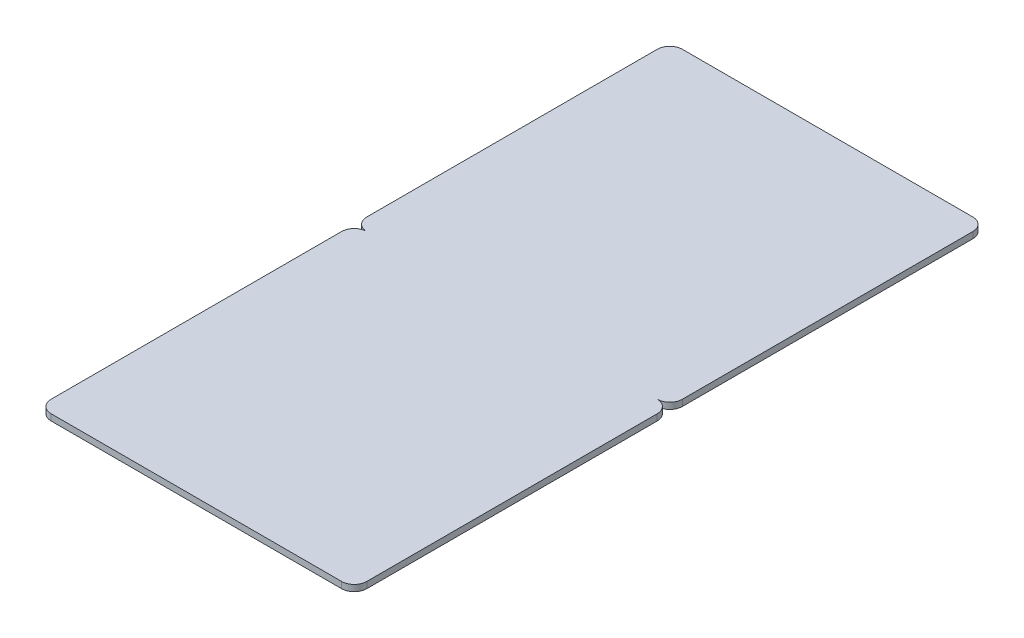
ISO-10303-21;
HEADER;
FILE_DESCRIPTION(('STEP AP214'),'2;1');
FILE_NAME('part.step','',(''),(''),'','','');
FILE_SCHEMA(('AUTOMOTIVE_DESIGN { 1 0 10303 214 1 1 1 1 }'));
ENDSEC;
DATA;
#1=APPLICATION_CONTEXT('core data for automotive mechanical design processes');
#2=APPLICATION_PROTOCOL_DEFINITION('international standard','automotive_design',2000,#1);
#3=PRODUCT_CONTEXT('',#1,'mechanical');
#4=PRODUCT('Part','Part','',(#3));
#5=PRODUCT_RELATED_PRODUCT_CATEGORY('part','',(#4));
#6=PRODUCT_DEFINITION_FORMATION('','',#4);
#7=PRODUCT_DEFINITION_CONTEXT('part definition',#1,'design');
#8=PRODUCT_DEFINITION('design','',#6,#7);
#9=PRODUCT_DEFINITION_SHAPE('','',#8);
#10=(LENGTH_UNIT() NAMED_UNIT(*) SI_UNIT(.MILLI.,.METRE.));
#11=(NAMED_UNIT(*) PLANE_ANGLE_UNIT() SI_UNIT($,.RADIAN.));
#12=(NAMED_UNIT(*) SI_UNIT($,.STERADIAN.) SOLID_ANGLE_UNIT());
#13=UNCERTAINTY_MEASURE_WITH_UNIT(LENGTH_MEASURE(1.E-05),#10,'distance_accuracy_value','');
#14=(GEOMETRIC_REPRESENTATION_CONTEXT(3) GLOBAL_UNCERTAINTY_ASSIGNED_CONTEXT((#13)) GLOBAL_UNIT_ASSIGNED_CONTEXT((#10,
#11,#12)) REPRESENTATION_CONTEXT('',''));
#15=CARTESIAN_POINT('',(0.,0.,0.));
#16=DIRECTION('',(0.,0.,1.));
#17=DIRECTION('',(1.,0.,0.));
#18=AXIS2_PLACEMENT_3D('',#15,#16,#17);
#19=CARTESIAN_POINT('',(-11.5,0.5,-24.));
#20=DIRECTION('',(0.,-1.,0.));
#21=DIRECTION('',(0.,0.,-1.));
#22=AXIS2_PLACEMENT_3D('',#19,#20,#21);
#23=CYLINDRICAL_SURFACE('',#22,1.);
#24=CARTESIAN_POINT('',(-11.5,0.,-24.));
#25=DIRECTION('',(0.,1.,0.));
#26=DIRECTION('',(0.,0.,-1.));
#27=AXIS2_PLACEMENT_3D('',#24,#25,#26);
#28=CIRCLE('',#27,1.);
#29=CARTESIAN_POINT('',(-11.5,0.,-25.));
#30=VERTEX_POINT('',#29);
#31=CARTESIAN_POINT('',(-12.5,0.,-24.));
#32=VERTEX_POINT('',#31);
#33=EDGE_CURVE('E134',#30,#32,#28,.T.);
#34=ORIENTED_EDGE('',*,*,#33,.T.);
#35=DIRECTION('',(0.,-1.,0.));
#36=VECTOR('',#35,1.);
#37=CARTESIAN_POINT('',(-12.5,0.5,-24.));
#38=LINE('',#37,#36);
#39=CARTESIAN_POINT('',(-12.5,0.5,-24.));
#40=VERTEX_POINT('',#39);
#41=EDGE_CURVE('E11',#40,#32,#38,.T.);
#42=ORIENTED_EDGE('',*,*,#41,.F.);
#43=CARTESIAN_POINT('',(-11.5,0.5,-24.));
#44=DIRECTION('',(0.,1.,0.));
#45=DIRECTION('',(0.,0.,-1.));
#46=AXIS2_PLACEMENT_3D('',#43,#44,#45);
#47=CIRCLE('',#46,1.);
#48=CARTESIAN_POINT('',(-11.5,0.5,-25.));
#49=VERTEX_POINT('',#48);
#50=EDGE_CURVE('E147',#49,#40,#47,.T.);
#51=ORIENTED_EDGE('',*,*,#50,.F.);
#52=DIRECTION('',(0.,-1.,0.));
#53=VECTOR('',#52,1.);
#54=CARTESIAN_POINT('',(-11.5,0.5,-25.));
#55=LINE('',#54,#53);
#56=EDGE_CURVE('E130',#49,#30,#55,.T.);
#57=ORIENTED_EDGE('',*,*,#56,.T.);
#58=EDGE_LOOP('',(#34,#42,#51,#57));
#59=FACE_BOUND('',#58,.T.);
#60=ADVANCED_FACE('F37',(#59),#23,.T.);
#61=CARTESIAN_POINT('',(-12.5,0.5,-1.));
#62=DIRECTION('',(1.,0.,0.));
#63=DIRECTION('',(0.,0.,-1.));
#64=AXIS2_PLACEMENT_3D('',#61,#62,#63);
#65=PLANE('',#64);
#66=DIRECTION('',(0.,0.,1.));
#67=VECTOR('',#66,1.);
#68=CARTESIAN_POINT('',(-12.5,0.,-1.));
#69=LINE('',#68,#67);
#70=CARTESIAN_POINT('',(-12.5,0.,-1.));
#71=VERTEX_POINT('',#70);
#72=EDGE_CURVE('E137',#32,#71,#69,.T.);
#73=ORIENTED_EDGE('',*,*,#72,.T.);
#74=DIRECTION('',(0.,-1.,0.));
#75=VECTOR('',#74,1.);
#76=CARTESIAN_POINT('',(-12.5,0.5,-1.));
#77=LINE('',#76,#75);
#78=CARTESIAN_POINT('',(-12.5,0.5,-1.));
#79=VERTEX_POINT('',#78);
#80=EDGE_CURVE('E45',#79,#71,#77,.T.);
#81=ORIENTED_EDGE('',*,*,#80,.F.);
#82=DIRECTION('',(0.,0.,1.));
#83=VECTOR('',#82,1.);
#84=CARTESIAN_POINT('',(-12.5,0.5,-1.));
#85=LINE('',#84,#83);
#86=EDGE_CURVE('E94',#40,#79,#85,.T.);
#87=ORIENTED_EDGE('',*,*,#86,.F.);
#88=ORIENTED_EDGE('',*,*,#41,.T.);
#89=EDGE_LOOP('',(#73,#81,#87,#88));
#90=FACE_BOUND('',#89,.T.);
#91=ADVANCED_FACE('F295',(#90),#65,.F.);
#92=CARTESIAN_POINT('',(-11.5,0.5,-1.));
#93=DIRECTION('',(0.,-1.,0.));
#94=DIRECTION('',(0.,0.,-1.));
#95=AXIS2_PLACEMENT_3D('',#92,#93,#94);
#96=CYLINDRICAL_SURFACE('',#95,1.);
#97=CARTESIAN_POINT('',(-11.5,0.,-1.));
#98=DIRECTION('',(0.,1.,0.));
#99=DIRECTION('',(0.,0.,-1.));
#100=AXIS2_PLACEMENT_3D('',#97,#98,#99);
#101=CIRCLE('',#100,1.);
#102=CARTESIAN_POINT('',(-11.5,0.,0.));
#103=VERTEX_POINT('',#102);
#104=EDGE_CURVE('E140',#71,#103,#101,.T.);
#105=ORIENTED_EDGE('',*,*,#104,.T.);
#106=DIRECTION('',(0.,-1.,0.));
#107=VECTOR('',#106,1.);
#108=CARTESIAN_POINT('',(-11.5,0.5,0.));
#109=LINE('',#108,#107);
#110=CARTESIAN_POINT('',(-11.5,0.5,0.));
#111=VERTEX_POINT('',#110);
#112=EDGE_CURVE('E199',#111,#103,#109,.T.);
#113=ORIENTED_EDGE('',*,*,#112,.F.);
#114=CARTESIAN_POINT('',(-11.5,0.5,-1.));
#115=DIRECTION('',(0.,1.,0.));
#116=DIRECTION('',(0.,0.,-1.));
#117=AXIS2_PLACEMENT_3D('',#114,#115,#116);
#118=CIRCLE('',#117,1.);
#119=EDGE_CURVE('E157',#79,#111,#118,.T.);
#120=ORIENTED_EDGE('',*,*,#119,.F.);
#121=ORIENTED_EDGE('',*,*,#80,.T.);
#122=EDGE_LOOP('',(#105,#113,#120,#121));
#123=FACE_BOUND('',#122,.T.);
#124=ADVANCED_FACE('F154',(#123),#96,.T.);
#125=CARTESIAN_POINT('',(11.5,0.5,-0.999999999999999));
#126=DIRECTION('',(0.,-1.,0.));
#127=DIRECTION('',(0.,0.,-1.));
#128=AXIS2_PLACEMENT_3D('',#125,#126,#127);
#129=CYLINDRICAL_SURFACE('',#128,0.999999999999999);
#130=CARTESIAN_POINT('',(11.5,0.,-0.999999999999999));
#131=DIRECTION('',(0.,1.,0.));
#132=DIRECTION('',(0.,0.,1.));
#133=AXIS2_PLACEMENT_3D('',#130,#131,#132);
#134=CIRCLE('',#133,0.999999999999999);
#135=CARTESIAN_POINT('',(11.5,0.,0.));
#136=VERTEX_POINT('',#135);
#137=CARTESIAN_POINT('',(12.5,0.,-0.999999999999999));
#138=VERTEX_POINT('',#137);
#139=EDGE_CURVE('E142',#136,#138,#134,.T.);
#140=ORIENTED_EDGE('',*,*,#139,.T.);
#141=DIRECTION('',(0.,-1.,0.));
#142=VECTOR('',#141,1.);
#143=CARTESIAN_POINT('',(12.5,0.5,-0.999999999999999));
#144=LINE('',#143,#142);
#145=CARTESIAN_POINT('',(12.5,0.5,-0.999999999999999));
#146=VERTEX_POINT('',#145);
#147=EDGE_CURVE('E125',#146,#138,#144,.T.);
#148=ORIENTED_EDGE('',*,*,#147,.F.);
#149=CARTESIAN_POINT('',(11.5,0.5,-0.999999999999999));
#150=DIRECTION('',(0.,1.,0.));
#151=DIRECTION('',(0.,0.,1.));
#152=AXIS2_PLACEMENT_3D('',#149,#150,#151);
#153=CIRCLE('',#152,0.999999999999999);
#154=CARTESIAN_POINT('',(11.5,0.5,0.));
#155=VERTEX_POINT('',#154);
#156=EDGE_CURVE('E116',#155,#146,#153,.T.);
#157=ORIENTED_EDGE('',*,*,#156,.F.);
#158=DIRECTION('',(0.,-1.,0.));
#159=VECTOR('',#158,1.);
#160=CARTESIAN_POINT('',(11.5,0.5,0.));
#161=LINE('',#160,#159);
#162=EDGE_CURVE('E201',#155,#136,#161,.T.);
#163=ORIENTED_EDGE('',*,*,#162,.T.);
#164=EDGE_LOOP('',(#140,#148,#157,#163));
#165=FACE_BOUND('',#164,.T.);
#166=ADVANCED_FACE('F254',(#165),#129,.T.);
#167=CARTESIAN_POINT('',(12.5,0.5,-0.999999999999999));
#168=DIRECTION('',(-1.,0.,0.));
#169=DIRECTION('',(0.,0.,1.));
#170=AXIS2_PLACEMENT_3D('',#167,#168,#169);
#171=PLANE('',#170);
#172=DIRECTION('',(0.,0.,-1.));
#173=VECTOR('',#172,1.);
#174=CARTESIAN_POINT('',(12.5,0.,-0.999999999999999));
#175=LINE('',#174,#173);
#176=CARTESIAN_POINT('',(12.5,0.,-24.));
#177=VERTEX_POINT('',#176);
#178=EDGE_CURVE('E124',#138,#177,#175,.T.);
#179=ORIENTED_EDGE('',*,*,#178,.T.);
#180=DIRECTION('',(0.,-1.,0.));
#181=VECTOR('',#180,1.);
#182=CARTESIAN_POINT('',(12.5,0.5,-24.));
#183=LINE('',#182,#181);
#184=CARTESIAN_POINT('',(12.5,0.5,-24.));
#185=VERTEX_POINT('',#184);
#186=EDGE_CURVE('E121',#185,#177,#183,.T.);
#187=ORIENTED_EDGE('',*,*,#186,.F.);
#188=DIRECTION('',(0.,0.,-1.));
#189=VECTOR('',#188,1.);
#190=CARTESIAN_POINT('',(12.5,0.5,-0.999999999999999));
#191=LINE('',#190,#189);
#192=EDGE_CURVE('E110',#146,#185,#191,.T.);
#193=ORIENTED_EDGE('',*,*,#192,.F.);
#194=ORIENTED_EDGE('',*,*,#147,.T.);
#195=EDGE_LOOP('',(#179,#187,#193,#194));
#196=FACE_BOUND('',#195,.T.);
#197=ADVANCED_FACE('F122',(#196),#171,.F.);
#198=CARTESIAN_POINT('',(11.5,0.5,-24.));
#199=DIRECTION('',(0.,-1.,0.));
#200=DIRECTION('',(0.,0.,-1.));
#201=AXIS2_PLACEMENT_3D('',#198,#199,#200);
#202=CYLINDRICAL_SURFACE('',#201,1.);
#203=CARTESIAN_POINT('',(11.5,0.,-24.));
#204=DIRECTION('',(0.,1.,0.));
#205=DIRECTION('',(0.,0.,1.));
#206=AXIS2_PLACEMENT_3D('',#203,#204,#205);
#207=CIRCLE('',#206,1.);
#208=CARTESIAN_POINT('',(11.5,0.,-25.));
#209=VERTEX_POINT('',#208);
#210=EDGE_CURVE('E80',#177,#209,#207,.T.);
#211=ORIENTED_EDGE('',*,*,#210,.T.);
#212=DIRECTION('',(0.,-1.,0.));
#213=VECTOR('',#212,1.);
#214=CARTESIAN_POINT('',(11.5,0.5,-25.));
#215=LINE('',#214,#213);
#216=CARTESIAN_POINT('',(11.5,0.5,-25.));
#217=VERTEX_POINT('',#216);
#218=EDGE_CURVE('E126',#217,#209,#215,.T.);
#219=ORIENTED_EDGE('',*,*,#218,.F.);
#220=CARTESIAN_POINT('',(11.5,0.5,-24.));
#221=DIRECTION('',(0.,1.,0.));
#222=DIRECTION('',(0.,0.,1.));
#223=AXIS2_PLACEMENT_3D('',#220,#221,#222);
#224=CIRCLE('',#223,1.);
#225=EDGE_CURVE('E114',#185,#217,#224,.T.);
#226=ORIENTED_EDGE('',*,*,#225,.F.);
#227=ORIENTED_EDGE('',*,*,#186,.T.);
#228=EDGE_LOOP('',(#211,#219,#226,#227));
#229=FACE_BOUND('',#228,.T.);
#230=ADVANCED_FACE('F128',(#229),#202,.T.);
#231=CARTESIAN_POINT('',(-11.5,0.5,-25.));
#232=DIRECTION('',(0.,0.,1.));
#233=DIRECTION('',(1.,0.,0.));
#234=AXIS2_PLACEMENT_3D('',#231,#232,#233);
#235=PLANE('',#234);
#236=DIRECTION('',(-1.,0.,0.));
#237=VECTOR('',#236,1.);
#238=CARTESIAN_POINT('',(-11.5,0.,-25.));
#239=LINE('',#238,#237);
#240=EDGE_CURVE('E86',#209,#30,#239,.T.);
#241=ORIENTED_EDGE('',*,*,#240,.T.);
#242=ORIENTED_EDGE('',*,*,#56,.F.);
#243=DIRECTION('',(-1.,0.,0.));
#244=VECTOR('',#243,1.);
#245=CARTESIAN_POINT('',(-11.5,0.5,-25.));
#246=LINE('',#245,#244);
#247=EDGE_CURVE('E53',#217,#49,#246,.T.);
#248=ORIENTED_EDGE('',*,*,#247,.F.);
#249=ORIENTED_EDGE('',*,*,#218,.T.);
#250=EDGE_LOOP('',(#241,#242,#248,#249));
#251=FACE_BOUND('',#250,.T.);
#252=ADVANCED_FACE('F302',(#251),#235,.F.);
#253=CARTESIAN_POINT('',(-11.5,0.5,-24.));
#254=DIRECTION('',(0.,-1.,0.));
#255=DIRECTION('',(0.,0.,-1.));
#256=AXIS2_PLACEMENT_3D('',#253,#254,#255);
#257=PLANE('',#256);
#258=ORIENTED_EDGE('',*,*,#50,.T.);
#259=ORIENTED_EDGE('',*,*,#86,.T.);
#260=ORIENTED_EDGE('',*,*,#119,.T.);
#261=CARTESIAN_POINT('',(-11.5,0.5,0.999999999999999));
#262=DIRECTION('',(0.,1.,0.));
#263=DIRECTION('',(0.,0.,-1.));
#264=AXIS2_PLACEMENT_3D('',#261,#262,#263);
#265=CIRCLE('',#264,0.999999999999999);
#266=CARTESIAN_POINT('',(-12.5,0.5,0.999999999999999));
#267=VERTEX_POINT('',#266);
#268=EDGE_CURVE('E215',#111,#267,#265,.T.);
#269=ORIENTED_EDGE('',*,*,#268,.T.);
#270=DIRECTION('',(0.,0.,1.));
#271=VECTOR('',#270,1.);
#272=CARTESIAN_POINT('',(-12.5,0.5,0.999999999999999));
#273=LINE('',#272,#271);
#274=CARTESIAN_POINT('',(-12.5,0.5,24.));
#275=VERTEX_POINT('',#274);
#276=EDGE_CURVE('E218',#267,#275,#273,.T.);
#277=ORIENTED_EDGE('',*,*,#276,.T.);
#278=CARTESIAN_POINT('',(-11.5,0.5,24.));
#279=DIRECTION('',(0.,1.,0.));
#280=DIRECTION('',(0.,0.,-1.));
#281=AXIS2_PLACEMENT_3D('',#278,#279,#280);
#282=CIRCLE('',#281,1.);
#283=CARTESIAN_POINT('',(-11.5,0.5,25.));
#284=VERTEX_POINT('',#283);
#285=EDGE_CURVE('E221',#275,#284,#282,.T.);
#286=ORIENTED_EDGE('',*,*,#285,.T.);
#287=DIRECTION('',(1.,0.,0.));
#288=VECTOR('',#287,1.);
#289=CARTESIAN_POINT('',(11.5,0.5,25.));
#290=LINE('',#289,#288);
#291=CARTESIAN_POINT('',(11.5,0.5,25.));
#292=VERTEX_POINT('',#291);
#293=EDGE_CURVE('E191',#284,#292,#290,.T.);
#294=ORIENTED_EDGE('',*,*,#293,.T.);
#295=CARTESIAN_POINT('',(11.5,0.5,24.));
#296=DIRECTION('',(0.,1.,0.));
#297=DIRECTION('',(0.,0.,1.));
#298=AXIS2_PLACEMENT_3D('',#295,#296,#297);
#299=CIRCLE('',#298,1.);
#300=CARTESIAN_POINT('',(12.5,0.5,24.));
#301=VERTEX_POINT('',#300);
#302=EDGE_CURVE('E186',#292,#301,#299,.T.);
#303=ORIENTED_EDGE('',*,*,#302,.T.);
#304=DIRECTION('',(0.,0.,-1.));
#305=VECTOR('',#304,1.);
#306=CARTESIAN_POINT('',(12.5,0.5,1.));
#307=LINE('',#306,#305);
#308=CARTESIAN_POINT('',(12.5,0.5,1.));
#309=VERTEX_POINT('',#308);
#310=EDGE_CURVE('E223',#301,#309,#307,.T.);
#311=ORIENTED_EDGE('',*,*,#310,.T.);
#312=CARTESIAN_POINT('',(11.5,0.5,1.));
#313=DIRECTION('',(0.,1.,0.));
#314=DIRECTION('',(0.,0.,1.));
#315=AXIS2_PLACEMENT_3D('',#312,#313,#314);
#316=CIRCLE('',#315,1.);
#317=EDGE_CURVE('E219',#309,#155,#316,.T.);
#318=ORIENTED_EDGE('',*,*,#317,.T.);
#319=ORIENTED_EDGE('',*,*,#156,.T.);
#320=ORIENTED_EDGE('',*,*,#192,.T.);
#321=ORIENTED_EDGE('',*,*,#225,.T.);
#322=ORIENTED_EDGE('',*,*,#247,.T.);
#323=EDGE_LOOP('',(#258,#259,#260,#269,#277,#286,#294,#303,#311,#318,#319,#320,#321,#322));
#324=FACE_BOUND('',#323,.T.);
#325=ADVANCED_FACE('F112',(#324),#257,.F.);
#326=CARTESIAN_POINT('',(-11.5,0.,-24.));
#327=DIRECTION('',(0.,-1.,0.));
#328=DIRECTION('',(0.,0.,-1.));
#329=AXIS2_PLACEMENT_3D('',#326,#327,#328);
#330=PLANE('',#329);
#331=ORIENTED_EDGE('',*,*,#33,.F.);
#332=ORIENTED_EDGE('',*,*,#240,.F.);
#333=ORIENTED_EDGE('',*,*,#210,.F.);
#334=ORIENTED_EDGE('',*,*,#178,.F.);
#335=ORIENTED_EDGE('',*,*,#139,.F.);
#336=CARTESIAN_POINT('',(11.5,0.,1.));
#337=DIRECTION('',(0.,1.,0.));
#338=DIRECTION('',(0.,0.,1.));
#339=AXIS2_PLACEMENT_3D('',#336,#337,#338);
#340=CIRCLE('',#339,1.);
#341=CARTESIAN_POINT('',(12.5,0.,1.));
#342=VERTEX_POINT('',#341);
#343=EDGE_CURVE('E172',#342,#136,#340,.T.);
#344=ORIENTED_EDGE('',*,*,#343,.F.);
#345=DIRECTION('',(0.,0.,-1.));
#346=VECTOR('',#345,1.);
#347=CARTESIAN_POINT('',(12.5,0.,1.));
#348=LINE('',#347,#346);
#349=CARTESIAN_POINT('',(12.5,0.,24.));
#350=VERTEX_POINT('',#349);
#351=EDGE_CURVE('E177',#350,#342,#348,.T.);
#352=ORIENTED_EDGE('',*,*,#351,.F.);
#353=CARTESIAN_POINT('',(11.5,0.,24.));
#354=DIRECTION('',(0.,1.,0.));
#355=DIRECTION('',(0.,0.,1.));
#356=AXIS2_PLACEMENT_3D('',#353,#354,#355);
#357=CIRCLE('',#356,1.);
#358=CARTESIAN_POINT('',(11.5,0.,25.));
#359=VERTEX_POINT('',#358);
#360=EDGE_CURVE('E231',#359,#350,#357,.T.);
#361=ORIENTED_EDGE('',*,*,#360,.F.);
#362=DIRECTION('',(1.,0.,0.));
#363=VECTOR('',#362,1.);
#364=CARTESIAN_POINT('',(11.5,0.,25.));
#365=LINE('',#364,#363);
#366=CARTESIAN_POINT('',(-11.5,0.,25.));
#367=VERTEX_POINT('',#366);
#368=EDGE_CURVE('E183',#367,#359,#365,.T.);
#369=ORIENTED_EDGE('',*,*,#368,.F.);
#370=CARTESIAN_POINT('',(-11.5,0.,24.));
#371=DIRECTION('',(0.,1.,0.));
#372=DIRECTION('',(0.,0.,-1.));
#373=AXIS2_PLACEMENT_3D('',#370,#371,#372);
#374=CIRCLE('',#373,1.);
#375=CARTESIAN_POINT('',(-12.5,0.,24.));
#376=VERTEX_POINT('',#375);
#377=EDGE_CURVE('E174',#376,#367,#374,.T.);
#378=ORIENTED_EDGE('',*,*,#377,.F.);
#379=DIRECTION('',(0.,0.,1.));
#380=VECTOR('',#379,1.);
#381=CARTESIAN_POINT('',(-12.5,0.,0.999999999999999));
#382=LINE('',#381,#380);
#383=CARTESIAN_POINT('',(-12.5,0.,0.999999999999999));
#384=VERTEX_POINT('',#383);
#385=EDGE_CURVE('E168',#384,#376,#382,.T.);
#386=ORIENTED_EDGE('',*,*,#385,.F.);
#387=CARTESIAN_POINT('',(-11.5,0.,0.999999999999999));
#388=DIRECTION('',(0.,1.,0.));
#389=DIRECTION('',(0.,0.,-1.));
#390=AXIS2_PLACEMENT_3D('',#387,#388,#389);
#391=CIRCLE('',#390,0.999999999999999);
#392=EDGE_CURVE('E164',#103,#384,#391,.T.);
#393=ORIENTED_EDGE('',*,*,#392,.F.);
#394=ORIENTED_EDGE('',*,*,#104,.F.);
#395=ORIENTED_EDGE('',*,*,#72,.F.);
#396=EDGE_LOOP('',(#331,#332,#333,#334,#335,#344,#352,#361,#369,#378,#386,#393,#394,#395));
#397=FACE_BOUND('',#396,.T.);
#398=ADVANCED_FACE('F161',(#397),#330,.T.);
#399=CARTESIAN_POINT('',(11.5,0.5,24.));
#400=DIRECTION('',(0.,-1.,0.));
#401=DIRECTION('',(0.,0.,1.));
#402=AXIS2_PLACEMENT_3D('',#399,#400,#401);
#403=CYLINDRICAL_SURFACE('',#402,1.);
#404=ORIENTED_EDGE('',*,*,#360,.T.);
#405=DIRECTION('',(0.,-1.,0.));
#406=VECTOR('',#405,1.);
#407=CARTESIAN_POINT('',(12.5,0.5,24.));
#408=LINE('',#407,#406);
#409=EDGE_CURVE('E138',#301,#350,#408,.T.);
#410=ORIENTED_EDGE('',*,*,#409,.F.);
#411=ORIENTED_EDGE('',*,*,#302,.F.);
#412=DIRECTION('',(0.,-1.,0.));
#413=VECTOR('',#412,1.);
#414=CARTESIAN_POINT('',(11.5,0.5,25.));
#415=LINE('',#414,#413);
#416=EDGE_CURVE('E187',#292,#359,#415,.T.);
#417=ORIENTED_EDGE('',*,*,#416,.T.);
#418=EDGE_LOOP('',(#404,#410,#411,#417));
#419=FACE_BOUND('',#418,.T.);
#420=ADVANCED_FACE('F284',(#419),#403,.T.);
#421=CARTESIAN_POINT('',(12.5,0.5,1.));
#422=DIRECTION('',(-1.,0.,0.));
#423=DIRECTION('',(0.,0.,1.));
#424=AXIS2_PLACEMENT_3D('',#421,#422,#423);
#425=PLANE('',#424);
#426=ORIENTED_EDGE('',*,*,#351,.T.);
#427=DIRECTION('',(0.,-1.,0.));
#428=VECTOR('',#427,1.);
#429=CARTESIAN_POINT('',(12.5,0.5,1.));
#430=LINE('',#429,#428);
#431=EDGE_CURVE('E204',#309,#342,#430,.T.);
#432=ORIENTED_EDGE('',*,*,#431,.F.);
#433=ORIENTED_EDGE('',*,*,#310,.F.);
#434=ORIENTED_EDGE('',*,*,#409,.T.);
#435=EDGE_LOOP('',(#426,#432,#433,#434));
#436=FACE_BOUND('',#435,.T.);
#437=ADVANCED_FACE('F238',(#436),#425,.F.);
#438=CARTESIAN_POINT('',(11.5,0.5,1.));
#439=DIRECTION('',(0.,-1.,0.));
#440=DIRECTION('',(0.,0.,1.));
#441=AXIS2_PLACEMENT_3D('',#438,#439,#440);
#442=CYLINDRICAL_SURFACE('',#441,1.);
#443=ORIENTED_EDGE('',*,*,#343,.T.);
#444=ORIENTED_EDGE('',*,*,#162,.F.);
#445=ORIENTED_EDGE('',*,*,#317,.F.);
#446=ORIENTED_EDGE('',*,*,#431,.T.);
#447=EDGE_LOOP('',(#443,#444,#445,#446));
#448=FACE_BOUND('',#447,.T.);
#449=ADVANCED_FACE('F249',(#448),#442,.T.);
#450=CARTESIAN_POINT('',(-11.5,0.5,0.999999999999999));
#451=DIRECTION('',(0.,-1.,0.));
#452=DIRECTION('',(0.,0.,1.));
#453=AXIS2_PLACEMENT_3D('',#450,#451,#452);
#454=CYLINDRICAL_SURFACE('',#453,0.999999999999999);
#455=ORIENTED_EDGE('',*,*,#392,.T.);
#456=DIRECTION('',(0.,-1.,0.));
#457=VECTOR('',#456,1.);
#458=CARTESIAN_POINT('',(-12.5,0.5,0.999999999999999));
#459=LINE('',#458,#457);
#460=EDGE_CURVE('E197',#267,#384,#459,.T.);
#461=ORIENTED_EDGE('',*,*,#460,.F.);
#462=ORIENTED_EDGE('',*,*,#268,.F.);
#463=ORIENTED_EDGE('',*,*,#112,.T.);
#464=EDGE_LOOP('',(#455,#461,#462,#463));
#465=FACE_BOUND('',#464,.T.);
#466=ADVANCED_FACE('F216',(#465),#454,.T.);
#467=CARTESIAN_POINT('',(-12.5,0.5,0.999999999999999));
#468=DIRECTION('',(1.,0.,0.));
#469=DIRECTION('',(0.,0.,-1.));
#470=AXIS2_PLACEMENT_3D('',#467,#468,#469);
#471=PLANE('',#470);
#472=ORIENTED_EDGE('',*,*,#385,.T.);
#473=DIRECTION('',(0.,-1.,0.));
#474=VECTOR('',#473,1.);
#475=CARTESIAN_POINT('',(-12.5,0.5,24.));
#476=LINE('',#475,#474);
#477=EDGE_CURVE('E194',#275,#376,#476,.T.);
#478=ORIENTED_EDGE('',*,*,#477,.F.);
#479=ORIENTED_EDGE('',*,*,#276,.F.);
#480=ORIENTED_EDGE('',*,*,#460,.T.);
#481=EDGE_LOOP('',(#472,#478,#479,#480));
#482=FACE_BOUND('',#481,.T.);
#483=ADVANCED_FACE('F381',(#482),#471,.F.);
#484=CARTESIAN_POINT('',(-11.5,0.5,24.));
#485=DIRECTION('',(0.,-1.,0.));
#486=DIRECTION('',(0.,0.,1.));
#487=AXIS2_PLACEMENT_3D('',#484,#485,#486);
#488=CYLINDRICAL_SURFACE('',#487,1.);
#489=ORIENTED_EDGE('',*,*,#377,.T.);
#490=DIRECTION('',(0.,-1.,0.));
#491=VECTOR('',#490,1.);
#492=CARTESIAN_POINT('',(-11.5,0.5,25.));
#493=LINE('',#492,#491);
#494=EDGE_CURVE('E190',#284,#367,#493,.T.);
#495=ORIENTED_EDGE('',*,*,#494,.F.);
#496=ORIENTED_EDGE('',*,*,#285,.F.);
#497=ORIENTED_EDGE('',*,*,#477,.T.);
#498=EDGE_LOOP('',(#489,#495,#496,#497));
#499=FACE_BOUND('',#498,.T.);
#500=ADVANCED_FACE('F275',(#499),#488,.T.);
#501=CARTESIAN_POINT('',(11.5,0.5,25.));
#502=DIRECTION('',(0.,0.,-1.));
#503=DIRECTION('',(-1.,0.,0.));
#504=AXIS2_PLACEMENT_3D('',#501,#502,#503);
#505=PLANE('',#504);
#506=ORIENTED_EDGE('',*,*,#368,.T.);
#507=ORIENTED_EDGE('',*,*,#416,.F.);
#508=ORIENTED_EDGE('',*,*,#293,.F.);
#509=ORIENTED_EDGE('',*,*,#494,.T.);
#510=EDGE_LOOP('',(#506,#507,#508,#509));
#511=FACE_BOUND('',#510,.T.);
#512=ADVANCED_FACE('F281',(#511),#505,.F.);
#513=CLOSED_SHELL('',(#60,#91,#124,#166,#197,#230,#252,#325,#398,#420,#437,#449,#466,#483,#500,#512));
#514=MANIFOLD_SOLID_BREP('B2',#513);
#515=ADVANCED_BREP_SHAPE_REPRESENTATION('',(#18,#514),#14);
#516=SHAPE_DEFINITION_REPRESENTATION(#9,#515);
ENDSEC;
END-ISO-10303-21;
